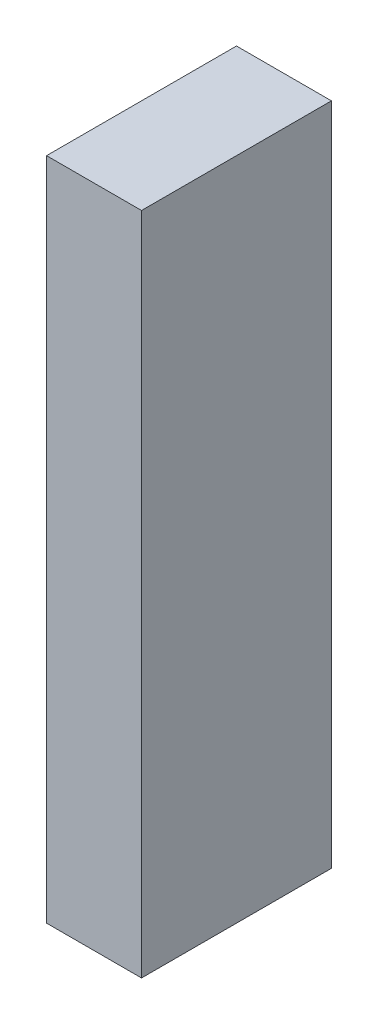
ISO-10303-21;
HEADER;
FILE_DESCRIPTION(('STEP AP214'),'2;1');
FILE_NAME('part.step','',(''),(''),'','','');
FILE_SCHEMA(('AUTOMOTIVE_DESIGN { 1 0 10303 214 1 1 1 1 }'));
ENDSEC;
DATA;
#1=APPLICATION_CONTEXT('core data for automotive mechanical design processes');
#2=APPLICATION_PROTOCOL_DEFINITION('international standard','automotive_design',2000,#1);
#3=PRODUCT_CONTEXT('',#1,'mechanical');
#4=PRODUCT('Part','Part','',(#3));
#5=PRODUCT_RELATED_PRODUCT_CATEGORY('part','',(#4));
#6=PRODUCT_DEFINITION_FORMATION('','',#4);
#7=PRODUCT_DEFINITION_CONTEXT('part definition',#1,'design');
#8=PRODUCT_DEFINITION('design','',#6,#7);
#9=PRODUCT_DEFINITION_SHAPE('','',#8);
#10=(LENGTH_UNIT() NAMED_UNIT(*) SI_UNIT(.MILLI.,.METRE.));
#11=(NAMED_UNIT(*) PLANE_ANGLE_UNIT() SI_UNIT($,.RADIAN.));
#12=(NAMED_UNIT(*) SI_UNIT($,.STERADIAN.) SOLID_ANGLE_UNIT());
#13=UNCERTAINTY_MEASURE_WITH_UNIT(LENGTH_MEASURE(1.E-05),#10,'distance_accuracy_value','');
#14=(GEOMETRIC_REPRESENTATION_CONTEXT(3) GLOBAL_UNCERTAINTY_ASSIGNED_CONTEXT((#13)) GLOBAL_UNIT_ASSIGNED_CONTEXT((#10,
#11,#12)) REPRESENTATION_CONTEXT('',''));
#15=CARTESIAN_POINT('',(0.,0.,0.));
#16=DIRECTION('',(0.,0.,1.));
#17=DIRECTION('',(1.,0.,0.));
#18=AXIS2_PLACEMENT_3D('',#15,#16,#17);
#19=CARTESIAN_POINT('',(25.4,355.6,50.8));
#20=DIRECTION('',(-1.,0.,0.));
#21=DIRECTION('',(0.,0.,1.));
#22=AXIS2_PLACEMENT_3D('',#19,#20,#21);
#23=PLANE('',#22);
#24=DIRECTION('',(0.,0.,-1.));
#25=VECTOR('',#24,1.);
#26=CARTESIAN_POINT('',(25.4,0.,50.8));
#27=LINE('',#26,#25);
#28=CARTESIAN_POINT('',(25.4,0.,50.8));
#29=VERTEX_POINT('',#28);
#30=CARTESIAN_POINT('',(25.4,0.,-50.8));
#31=VERTEX_POINT('',#30);
#32=EDGE_CURVE('E107',#29,#31,#27,.T.);
#33=ORIENTED_EDGE('',*,*,#32,.T.);
#34=DIRECTION('',(0.,-1.,0.));
#35=VECTOR('',#34,1.);
#36=CARTESIAN_POINT('',(25.4,355.6,-50.8));
#37=LINE('',#36,#35);
#38=CARTESIAN_POINT('',(25.4,355.6,-50.8));
#39=VERTEX_POINT('',#38);
#40=EDGE_CURVE('E11',#39,#31,#37,.T.);
#41=ORIENTED_EDGE('',*,*,#40,.F.);
#42=DIRECTION('',(0.,0.,-1.));
#43=VECTOR('',#42,1.);
#44=CARTESIAN_POINT('',(25.4,355.6,50.8));
#45=LINE('',#44,#43);
#46=CARTESIAN_POINT('',(25.4,355.6,50.8));
#47=VERTEX_POINT('',#46);
#48=EDGE_CURVE('E91',#47,#39,#45,.T.);
#49=ORIENTED_EDGE('',*,*,#48,.F.);
#50=DIRECTION('',(0.,-1.,0.));
#51=VECTOR('',#50,1.);
#52=CARTESIAN_POINT('',(25.4,355.6,50.8));
#53=LINE('',#52,#51);
#54=EDGE_CURVE('E103',#47,#29,#53,.T.);
#55=ORIENTED_EDGE('',*,*,#54,.T.);
#56=EDGE_LOOP('',(#33,#41,#49,#55));
#57=FACE_BOUND('',#56,.T.);
#58=ADVANCED_FACE('F39',(#57),#23,.F.);
#59=CARTESIAN_POINT('',(-25.4,355.6,-50.8));
#60=DIRECTION('',(0.,0.,1.));
#61=DIRECTION('',(1.,0.,0.));
#62=AXIS2_PLACEMENT_3D('',#59,#60,#61);
#63=PLANE('',#62);
#64=DIRECTION('',(-1.,0.,0.));
#65=VECTOR('',#64,1.);
#66=CARTESIAN_POINT('',(-25.4,0.,-50.8));
#67=LINE('',#66,#65);
#68=CARTESIAN_POINT('',(-25.4,0.,-50.8));
#69=VERTEX_POINT('',#68);
#70=EDGE_CURVE('E96',#31,#69,#67,.T.);
#71=ORIENTED_EDGE('',*,*,#70,.T.);
#72=DIRECTION('',(0.,-1.,0.));
#73=VECTOR('',#72,1.);
#74=CARTESIAN_POINT('',(-25.4,355.6,-50.8));
#75=LINE('',#74,#73);
#76=CARTESIAN_POINT('',(-25.4,355.6,-50.8));
#77=VERTEX_POINT('',#76);
#78=EDGE_CURVE('E48',#77,#69,#75,.T.);
#79=ORIENTED_EDGE('',*,*,#78,.F.);
#80=DIRECTION('',(-1.,0.,0.));
#81=VECTOR('',#80,1.);
#82=CARTESIAN_POINT('',(-25.4,355.6,-50.8));
#83=LINE('',#82,#81);
#84=EDGE_CURVE('E86',#39,#77,#83,.T.);
#85=ORIENTED_EDGE('',*,*,#84,.F.);
#86=ORIENTED_EDGE('',*,*,#40,.T.);
#87=EDGE_LOOP('',(#71,#79,#85,#86));
#88=FACE_BOUND('',#87,.T.);
#89=ADVANCED_FACE('F95',(#88),#63,.F.);
#90=CARTESIAN_POINT('',(-25.4,355.6,50.8));
#91=DIRECTION('',(1.,0.,0.));
#92=DIRECTION('',(0.,0.,-1.));
#93=AXIS2_PLACEMENT_3D('',#90,#91,#92);
#94=PLANE('',#93);
#95=DIRECTION('',(0.,0.,1.));
#96=VECTOR('',#95,1.);
#97=CARTESIAN_POINT('',(-25.4,0.,50.8));
#98=LINE('',#97,#96);
#99=CARTESIAN_POINT('',(-25.4,0.,50.8));
#100=VERTEX_POINT('',#99);
#101=EDGE_CURVE('E73',#69,#100,#98,.T.);
#102=ORIENTED_EDGE('',*,*,#101,.T.);
#103=DIRECTION('',(0.,-1.,0.));
#104=VECTOR('',#103,1.);
#105=CARTESIAN_POINT('',(-25.4,355.6,50.8));
#106=LINE('',#105,#104);
#107=CARTESIAN_POINT('',(-25.4,355.6,50.8));
#108=VERTEX_POINT('',#107);
#109=EDGE_CURVE('E98',#108,#100,#106,.T.);
#110=ORIENTED_EDGE('',*,*,#109,.F.);
#111=DIRECTION('',(0.,0.,1.));
#112=VECTOR('',#111,1.);
#113=CARTESIAN_POINT('',(-25.4,355.6,50.8));
#114=LINE('',#113,#112);
#115=EDGE_CURVE('E89',#77,#108,#114,.T.);
#116=ORIENTED_EDGE('',*,*,#115,.F.);
#117=ORIENTED_EDGE('',*,*,#78,.T.);
#118=EDGE_LOOP('',(#102,#110,#116,#117));
#119=FACE_BOUND('',#118,.T.);
#120=ADVANCED_FACE('F99',(#119),#94,.F.);
#121=CARTESIAN_POINT('',(-25.4,355.6,50.8));
#122=DIRECTION('',(0.,0.,-1.));
#123=DIRECTION('',(-1.,0.,0.));
#124=AXIS2_PLACEMENT_3D('',#121,#122,#123);
#125=PLANE('',#124);
#126=DIRECTION('',(1.,0.,0.));
#127=VECTOR('',#126,1.);
#128=CARTESIAN_POINT('',(-25.4,0.,50.8));
#129=LINE('',#128,#127);
#130=EDGE_CURVE('E79',#100,#29,#129,.T.);
#131=ORIENTED_EDGE('',*,*,#130,.T.);
#132=ORIENTED_EDGE('',*,*,#54,.F.);
#133=DIRECTION('',(1.,0.,0.));
#134=VECTOR('',#133,1.);
#135=CARTESIAN_POINT('',(-25.4,355.6,50.8));
#136=LINE('',#135,#134);
#137=EDGE_CURVE('E56',#108,#47,#136,.T.);
#138=ORIENTED_EDGE('',*,*,#137,.F.);
#139=ORIENTED_EDGE('',*,*,#109,.T.);
#140=EDGE_LOOP('',(#131,#132,#138,#139));
#141=FACE_BOUND('',#140,.T.);
#142=ADVANCED_FACE('F120',(#141),#125,.F.);
#143=CARTESIAN_POINT('',(0.,355.6,0.));
#144=DIRECTION('',(0.,-1.,0.));
#145=DIRECTION('',(0.,0.,-1.));
#146=AXIS2_PLACEMENT_3D('',#143,#144,#145);
#147=PLANE('',#146);
#148=ORIENTED_EDGE('',*,*,#48,.T.);
#149=ORIENTED_EDGE('',*,*,#84,.T.);
#150=ORIENTED_EDGE('',*,*,#115,.T.);
#151=ORIENTED_EDGE('',*,*,#137,.T.);
#152=EDGE_LOOP('',(#148,#149,#150,#151));
#153=FACE_BOUND('',#152,.T.);
#154=ADVANCED_FACE('F87',(#153),#147,.F.);
#155=CARTESIAN_POINT('',(0.,0.,0.));
#156=DIRECTION('',(0.,-1.,0.));
#157=DIRECTION('',(0.,0.,-1.));
#158=AXIS2_PLACEMENT_3D('',#155,#156,#157);
#159=PLANE('',#158);
#160=ORIENTED_EDGE('',*,*,#32,.F.);
#161=ORIENTED_EDGE('',*,*,#130,.F.);
#162=ORIENTED_EDGE('',*,*,#101,.F.);
#163=ORIENTED_EDGE('',*,*,#70,.F.);
#164=EDGE_LOOP('',(#160,#161,#162,#163));
#165=FACE_BOUND('',#164,.T.);
#166=ADVANCED_FACE('F123',(#165),#159,.T.);
#167=CLOSED_SHELL('',(#58,#89,#120,#142,#154,#166));
#168=MANIFOLD_SOLID_BREP('B2',#167);
#169=ADVANCED_BREP_SHAPE_REPRESENTATION('',(#18,#168),#14);
#170=SHAPE_DEFINITION_REPRESENTATION(#9,#169);
ENDSEC;
END-ISO-10303-21;
